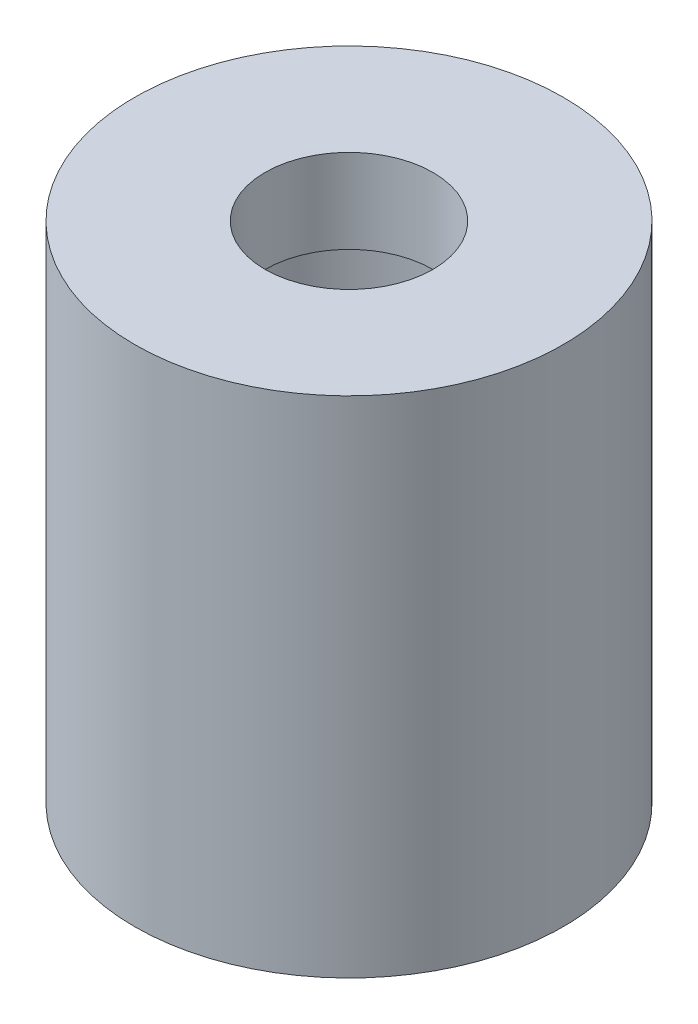
ISO-10303-21;
HEADER;
FILE_DESCRIPTION(('STEP AP214'),'2;1');
FILE_NAME('part.step','',(''),(''),'','','');
FILE_SCHEMA(('AUTOMOTIVE_DESIGN { 1 0 10303 214 1 1 1 1 }'));
ENDSEC;
DATA;
#1=APPLICATION_CONTEXT('core data for automotive mechanical design processes');
#2=APPLICATION_PROTOCOL_DEFINITION('international standard','automotive_design',2000,#1);
#3=PRODUCT_CONTEXT('',#1,'mechanical');
#4=PRODUCT('Part','Part','',(#3));
#5=PRODUCT_RELATED_PRODUCT_CATEGORY('part','',(#4));
#6=PRODUCT_DEFINITION_FORMATION('','',#4);
#7=PRODUCT_DEFINITION_CONTEXT('part definition',#1,'design');
#8=PRODUCT_DEFINITION('design','',#6,#7);
#9=PRODUCT_DEFINITION_SHAPE('','',#8);
#10=(LENGTH_UNIT() NAMED_UNIT(*) SI_UNIT(.MILLI.,.METRE.));
#11=(NAMED_UNIT(*) PLANE_ANGLE_UNIT() SI_UNIT($,.RADIAN.));
#12=(NAMED_UNIT(*) SI_UNIT($,.STERADIAN.) SOLID_ANGLE_UNIT());
#13=UNCERTAINTY_MEASURE_WITH_UNIT(LENGTH_MEASURE(1.E-05),#10,'distance_accuracy_value','');
#14=(GEOMETRIC_REPRESENTATION_CONTEXT(3) GLOBAL_UNCERTAINTY_ASSIGNED_CONTEXT((#13)) GLOBAL_UNIT_ASSIGNED_CONTEXT((#10,
#11,#12)) REPRESENTATION_CONTEXT('',''));
#15=CARTESIAN_POINT('',(0.,0.,0.));
#16=DIRECTION('',(0.,0.,1.));
#17=DIRECTION('',(1.,0.,0.));
#18=AXIS2_PLACEMENT_3D('',#15,#16,#17);
#19=CARTESIAN_POINT('',(0.,15.24,0.));
#20=DIRECTION('',(0.,-1.,0.));
#21=DIRECTION('',(0.,0.,-1.));
#22=AXIS2_PLACEMENT_3D('',#19,#20,#21);
#23=CYLINDRICAL_SURFACE('',#22,6.477);
#24=CARTESIAN_POINT('',(0.,15.24,0.));
#25=DIRECTION('',(0.,1.,0.));
#26=DIRECTION('',(0.,0.,1.));
#27=AXIS2_PLACEMENT_3D('',#24,#25,#26);
#28=CIRCLE('',#27,6.477);
#29=CARTESIAN_POINT('',(0.,15.24,-6.477));
#30=VERTEX_POINT('',#29);
#31=EDGE_CURVE('E10',#30,#30,#28,.T.);
#32=CARTESIAN_POINT('',(0.,0.,0.));
#33=DIRECTION('',(0.,1.,0.));
#34=DIRECTION('',(0.,0.,1.));
#35=AXIS2_PLACEMENT_3D('',#32,#33,#34);
#36=CIRCLE('',#35,6.477);
#37=CARTESIAN_POINT('',(0.,0.,-6.477));
#38=VERTEX_POINT('',#37);
#39=EDGE_CURVE('E40',#38,#38,#36,.T.);
#40=CARTESIAN_POINT('',(0.,15.24,-6.477));
#41=CARTESIAN_POINT('',(0.,15.08125,-6.477));
#42=CARTESIAN_POINT('',(0.,14.9225,-6.477));
#43=CARTESIAN_POINT('',(0.,14.605,-6.477));
#44=CARTESIAN_POINT('',(0.,14.44625,-6.477));
#45=CARTESIAN_POINT('',(0.,14.12875,-6.477));
#46=CARTESIAN_POINT('',(0.,13.97,-6.477));
#47=CARTESIAN_POINT('',(0.,13.6525,-6.477));
#48=CARTESIAN_POINT('',(0.,13.49375,-6.477));
#49=CARTESIAN_POINT('',(0.,13.17625,-6.477));
#50=CARTESIAN_POINT('',(0.,13.0175,-6.477));
#51=CARTESIAN_POINT('',(0.,12.7,-6.477));
#52=CARTESIAN_POINT('',(0.,12.54125,-6.477));
#53=CARTESIAN_POINT('',(0.,12.22375,-6.477));
#54=CARTESIAN_POINT('',(0.,12.065,-6.477));
#55=CARTESIAN_POINT('',(0.,11.7475,-6.477));
#56=CARTESIAN_POINT('',(0.,11.58875,-6.477));
#57=CARTESIAN_POINT('',(0.,11.27125,-6.477));
#58=CARTESIAN_POINT('',(0.,11.1125,-6.477));
#59=CARTESIAN_POINT('',(0.,10.795,-6.477));
#60=CARTESIAN_POINT('',(0.,10.63625,-6.477));
#61=CARTESIAN_POINT('',(0.,10.31875,-6.477));
#62=CARTESIAN_POINT('',(0.,10.16,-6.477));
#63=CARTESIAN_POINT('',(0.,9.8425,-6.477));
#64=CARTESIAN_POINT('',(0.,9.68375,-6.477));
#65=CARTESIAN_POINT('',(0.,9.36625,-6.477));
#66=CARTESIAN_POINT('',(0.,9.2075,-6.477));
#67=CARTESIAN_POINT('',(0.,8.89,-6.477));
#68=CARTESIAN_POINT('',(0.,8.73125,-6.477));
#69=CARTESIAN_POINT('',(0.,8.41375,-6.477));
#70=CARTESIAN_POINT('',(0.,8.255,-6.477));
#71=CARTESIAN_POINT('',(0.,7.9375,-6.477));
#72=CARTESIAN_POINT('',(0.,7.77875,-6.477));
#73=CARTESIAN_POINT('',(0.,7.46125,-6.477));
#74=CARTESIAN_POINT('',(0.,7.3025,-6.477));
#75=CARTESIAN_POINT('',(0.,6.985,-6.477));
#76=CARTESIAN_POINT('',(0.,6.82625,-6.477));
#77=CARTESIAN_POINT('',(0.,6.50875,-6.477));
#78=CARTESIAN_POINT('',(0.,6.35,-6.477));
#79=CARTESIAN_POINT('',(0.,6.0325,-6.477));
#80=CARTESIAN_POINT('',(0.,5.87375,-6.477));
#81=CARTESIAN_POINT('',(0.,5.55625,-6.477));
#82=CARTESIAN_POINT('',(0.,5.3975,-6.477));
#83=CARTESIAN_POINT('',(0.,5.08,-6.477));
#84=CARTESIAN_POINT('',(0.,4.92125,-6.477));
#85=CARTESIAN_POINT('',(0.,4.60375,-6.477));
#86=CARTESIAN_POINT('',(0.,4.445,-6.477));
#87=CARTESIAN_POINT('',(0.,4.1275,-6.477));
#88=CARTESIAN_POINT('',(0.,3.96875,-6.477));
#89=CARTESIAN_POINT('',(0.,3.65125,-6.477));
#90=CARTESIAN_POINT('',(0.,3.4925,-6.477));
#91=CARTESIAN_POINT('',(0.,3.175,-6.477));
#92=CARTESIAN_POINT('',(0.,3.01625,-6.477));
#93=CARTESIAN_POINT('',(0.,2.69875,-6.477));
#94=CARTESIAN_POINT('',(0.,2.54,-6.477));
#95=CARTESIAN_POINT('',(0.,2.2225,-6.477));
#96=CARTESIAN_POINT('',(0.,2.06375,-6.477));
#97=CARTESIAN_POINT('',(0.,1.74625,-6.477));
#98=CARTESIAN_POINT('',(0.,1.5875,-6.477));
#99=CARTESIAN_POINT('',(0.,1.27,-6.477));
#100=CARTESIAN_POINT('',(0.,1.11125,-6.477));
#101=CARTESIAN_POINT('',(0.,0.79375,-6.477));
#102=CARTESIAN_POINT('',(0.,0.634999999999999,-6.477));
#103=CARTESIAN_POINT('',(0.,0.3175,-6.477));
#104=CARTESIAN_POINT('',(0.,0.15875,-6.477));
#105=CARTESIAN_POINT('',(0.,0.,-6.477));
#106=B_SPLINE_CURVE_WITH_KNOTS('',3,(#40,#41,#42,#43,#44,#45,#46,#47,#48,#49,#50,#51,#52,#53,
#54,#55,#56,#57,#58,#59,#60,#61,#62,#63,#64,#65,#66,#67,#68,#69,#70,#71,#72,#73,#74,#75,#76,#77,
#78,#79,#80,#81,#82,#83,#84,#85,#86,#87,#88,#89,#90,#91,#92,#93,#94,#95,#96,#97,#98,#99,#100,
#101,#102,#103,#104,#105),.UNSPECIFIED.,.F.,.F.,(4,2,2,2,2,2,2,2,2,2,2,2,2,2,2,2,2,2,2,2,2,2,2,
2,2,2,2,2,2,2,2,2,4),(0.,0.476249999999999,0.952499999999998,1.42875,1.905,2.38125,2.8575,
3.33375,3.81,4.28625,4.7625,5.23875,5.715,6.19125,6.6675,7.14375,7.62,8.09625,8.5725,9.04875,
9.525,10.00125,10.4775,10.95375,11.43,11.90625,12.3825,12.85875,13.335,13.81125,14.2875,
14.76375,15.24),.UNSPECIFIED.);
#107=EDGE_CURVE('BSEAM33',#30,#38,#106,.T.);
#108=ORIENTED_EDGE('',*,*,#31,.F.);
#109=ORIENTED_EDGE('',*,*,#39,.T.);
#110=ORIENTED_EDGE('',*,*,#107,.T.);
#111=ORIENTED_EDGE('',*,*,#107,.F.);
#112=EDGE_LOOP('',(#108,#110,#109,#111));
#113=FACE_BOUND('',#112,.T.);
#114=ADVANCED_FACE('F33',(#113),#23,.T.);
#115=CARTESIAN_POINT('',(0.,15.24,0.));
#116=DIRECTION('',(0.,1.,0.));
#117=DIRECTION('',(0.,0.,1.));
#118=AXIS2_PLACEMENT_3D('',#115,#116,#117);
#119=PLANE('',#118);
#120=CARTESIAN_POINT('',(0.,15.24,0.));
#121=DIRECTION('',(0.,1.,0.));
#122=DIRECTION('',(0.,0.,1.));
#123=AXIS2_PLACEMENT_3D('',#120,#121,#122);
#124=CIRCLE('',#123,2.53901115903949);
#125=CARTESIAN_POINT('',(0.,15.24,2.53901115903949));
#126=VERTEX_POINT('',#125);
#127=EDGE_CURVE('E36',#126,#126,#124,.T.);
#128=ORIENTED_EDGE('',*,*,#127,.F.);
#129=EDGE_LOOP('',(#128));
#130=FACE_BOUND('',#129,.T.);
#131=ORIENTED_EDGE('',*,*,#31,.T.);
#132=EDGE_LOOP('',(#131));
#133=FACE_BOUND('',#132,.T.);
#134=ADVANCED_FACE('F61',(#130,#133),#119,.T.);
#135=CARTESIAN_POINT('',(0.,0.,0.));
#136=DIRECTION('',(0.,1.,0.));
#137=DIRECTION('',(0.,0.,1.));
#138=AXIS2_PLACEMENT_3D('',#135,#136,#137);
#139=PLANE('',#138);
#140=CARTESIAN_POINT('',(0.,0.,0.));
#141=DIRECTION('',(0.,-1.,0.));
#142=DIRECTION('',(0.,0.,-1.));
#143=AXIS2_PLACEMENT_3D('',#140,#141,#142);
#144=CIRCLE('',#143,4.064);
#145=CARTESIAN_POINT('',(0.,0.,-4.064));
#146=VERTEX_POINT('',#145);
#147=EDGE_CURVE('E47',#146,#146,#144,.T.);
#148=ORIENTED_EDGE('',*,*,#147,.F.);
#149=EDGE_LOOP('',(#148));
#150=FACE_BOUND('',#149,.T.);
#151=ORIENTED_EDGE('',*,*,#39,.F.);
#152=EDGE_LOOP('',(#151));
#153=FACE_BOUND('',#152,.T.);
#154=ADVANCED_FACE('F63',(#150,#153),#139,.F.);
#155=CARTESIAN_POINT('',(0.,12.7,0.));
#156=DIRECTION('',(0.,-1.,0.));
#157=DIRECTION('',(0.,0.,-1.));
#158=AXIS2_PLACEMENT_3D('',#155,#156,#157);
#159=CYLINDRICAL_SURFACE('',#158,4.064);
#160=CARTESIAN_POINT('',(0.,12.7,0.));
#161=DIRECTION('',(0.,-1.,0.));
#162=DIRECTION('',(0.,0.,-1.));
#163=AXIS2_PLACEMENT_3D('',#160,#161,#162);
#164=CIRCLE('',#163,4.064);
#165=CARTESIAN_POINT('',(0.,12.7,-4.064));
#166=VERTEX_POINT('',#165);
#167=EDGE_CURVE('E45',#166,#166,#164,.T.);
#168=ORIENTED_EDGE('',*,*,#167,.F.);
#169=EDGE_LOOP('',(#168));
#170=FACE_BOUND('',#169,.T.);
#171=ORIENTED_EDGE('',*,*,#147,.T.);
#172=EDGE_LOOP('',(#171));
#173=FACE_BOUND('',#172,.T.);
#174=ADVANCED_FACE('F69',(#170,#173),#159,.F.);
#175=CARTESIAN_POINT('',(0.,12.7,0.));
#176=DIRECTION('',(0.,-1.,0.));
#177=DIRECTION('',(0.,0.,-1.));
#178=AXIS2_PLACEMENT_3D('',#175,#176,#177);
#179=PLANE('',#178);
#180=CARTESIAN_POINT('',(0.,12.7,0.));
#181=DIRECTION('',(0.,-1.,0.));
#182=DIRECTION('',(0.,0.,-1.));
#183=AXIS2_PLACEMENT_3D('',#180,#181,#182);
#184=CIRCLE('',#183,2.53901115903949);
#185=CARTESIAN_POINT('',(0.,12.7,-2.53901115903949));
#186=VERTEX_POINT('',#185);
#187=EDGE_CURVE('E52',#186,#186,#184,.T.);
#188=ORIENTED_EDGE('',*,*,#187,.F.);
#189=EDGE_LOOP('',(#188));
#190=FACE_BOUND('',#189,.T.);
#191=ORIENTED_EDGE('',*,*,#167,.T.);
#192=EDGE_LOOP('',(#191));
#193=FACE_BOUND('',#192,.T.);
#194=ADVANCED_FACE('F75',(#190,#193),#179,.T.);
#195=CARTESIAN_POINT('',(0.,25.4,0.));
#196=DIRECTION('',(0.,-1.,0.));
#197=DIRECTION('',(0.,0.,-1.));
#198=AXIS2_PLACEMENT_3D('',#195,#196,#197);
#199=CYLINDRICAL_SURFACE('',#198,2.53901115903949);
#200=ORIENTED_EDGE('',*,*,#127,.T.);
#201=EDGE_LOOP('',(#200));
#202=FACE_BOUND('',#201,.T.);
#203=ORIENTED_EDGE('',*,*,#187,.T.);
#204=EDGE_LOOP('',(#203));
#205=FACE_BOUND('',#204,.T.);
#206=ADVANCED_FACE('F59',(#202,#205),#199,.F.);
#207=CLOSED_SHELL('',(#114,#134,#154,#174,#194,#206));
#208=MANIFOLD_SOLID_BREP('B2',#207);
#209=ADVANCED_BREP_SHAPE_REPRESENTATION('',(#18,#208),#14);
#210=SHAPE_DEFINITION_REPRESENTATION(#9,#209);
ENDSEC;
END-ISO-10303-21;
